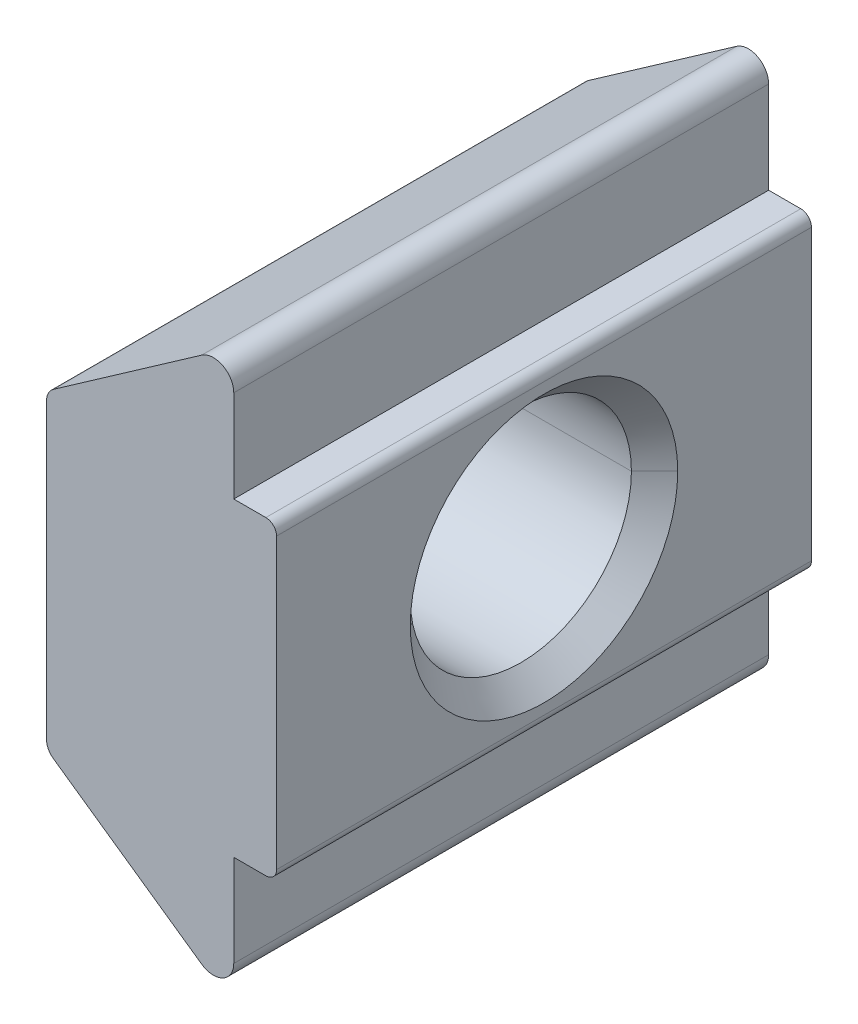
ISO-10303-21;
HEADER;
FILE_DESCRIPTION(('STEP AP214'),'2;1');
FILE_NAME('part.step','',(''),(''),'','','');
FILE_SCHEMA(('AUTOMOTIVE_DESIGN { 1 0 10303 214 1 1 1 1 }'));
ENDSEC;
DATA;
#1=APPLICATION_CONTEXT('core data for automotive mechanical design processes');
#2=APPLICATION_PROTOCOL_DEFINITION('international standard','automotive_design',2000,#1);
#3=PRODUCT_CONTEXT('',#1,'mechanical');
#4=PRODUCT('Part','Part','',(#3));
#5=PRODUCT_RELATED_PRODUCT_CATEGORY('part','',(#4));
#6=PRODUCT_DEFINITION_FORMATION('','',#4);
#7=PRODUCT_DEFINITION_CONTEXT('part definition',#1,'design');
#8=PRODUCT_DEFINITION('design','',#6,#7);
#9=PRODUCT_DEFINITION_SHAPE('','',#8);
#10=(LENGTH_UNIT() NAMED_UNIT(*) SI_UNIT(.MILLI.,.METRE.));
#11=(NAMED_UNIT(*) PLANE_ANGLE_UNIT() SI_UNIT($,.RADIAN.));
#12=(NAMED_UNIT(*) SI_UNIT($,.STERADIAN.) SOLID_ANGLE_UNIT());
#13=UNCERTAINTY_MEASURE_WITH_UNIT(LENGTH_MEASURE(1.E-05),#10,'distance_accuracy_value','');
#14=(GEOMETRIC_REPRESENTATION_CONTEXT(3) GLOBAL_UNCERTAINTY_ASSIGNED_CONTEXT((#13)) GLOBAL_UNIT_ASSIGNED_CONTEXT((#10,
#11,#12)) REPRESENTATION_CONTEXT('',''));
#15=CARTESIAN_POINT('',(0.,0.,0.));
#16=DIRECTION('',(0.,0.,1.));
#17=DIRECTION('',(1.,0.,0.));
#18=AXIS2_PLACEMENT_3D('',#15,#16,#17);
#19=CARTESIAN_POINT('',(-4.00000000000035,2.74380333152817,5.));
#20=DIRECTION('',(0.,0.,-1.));
#21=DIRECTION('',(0.886978676283514,-0.461810380804011,0.));
#22=AXIS2_PLACEMENT_3D('',#19,#20,#21);
#23=CYLINDRICAL_SURFACE('',#22,0.299999999999656);
#24=CARTESIAN_POINT('',(-4.00000000000035,2.74380333152817,-5.));
#25=DIRECTION('',(0.,0.,1.));
#26=DIRECTION('',(1.,0.,0.));
#27=AXIS2_PLACEMENT_3D('',#24,#25,#26);
#28=CIRCLE('',#27,0.299999999999656);
#29=CARTESIAN_POINT('',(-4.172038703309,2.9895729076837,-5.));
#30=VERTEX_POINT('',#29);
#31=CARTESIAN_POINT('',(-4.3,2.743803331528,-5.));
#32=VERTEX_POINT('',#31);
#33=EDGE_CURVE('E11',#30,#32,#28,.T.);
#34=ORIENTED_EDGE('',*,*,#33,.T.);
#35=DIRECTION('',(0.,0.,-1.));
#36=VECTOR('',#35,1.);
#37=CARTESIAN_POINT('',(-4.3,2.743803331528,5.));
#38=LINE('',#37,#36);
#39=CARTESIAN_POINT('',(-4.3,2.743803331528,5.));
#40=VERTEX_POINT('',#39);
#41=EDGE_CURVE('E25',#40,#32,#38,.T.);
#42=ORIENTED_EDGE('',*,*,#41,.F.);
#43=CARTESIAN_POINT('',(-4.00000000000035,2.74380333152817,5.));
#44=DIRECTION('',(0.,0.,1.));
#45=DIRECTION('',(1.,0.,0.));
#46=AXIS2_PLACEMENT_3D('',#43,#44,#45);
#47=CIRCLE('',#46,0.299999999999656);
#48=CARTESIAN_POINT('',(-4.172038703309,2.9895729076837,5.));
#49=VERTEX_POINT('',#48);
#50=EDGE_CURVE('E391',#49,#40,#47,.T.);
#51=ORIENTED_EDGE('',*,*,#50,.F.);
#52=DIRECTION('',(0.,0.,-1.));
#53=VECTOR('',#52,1.);
#54=CARTESIAN_POINT('',(-4.172038703309,2.9895729076837,5.));
#55=LINE('',#54,#53);
#56=EDGE_CURVE('E387',#49,#30,#55,.T.);
#57=ORIENTED_EDGE('',*,*,#56,.T.);
#58=EDGE_LOOP('',(#34,#42,#51,#57));
#59=FACE_BOUND('',#58,.T.);
#60=ADVANCED_FACE('F17',(#59),#23,.T.);
#61=CARTESIAN_POINT('',(-1.3982147651007,4.9312496644295,5.));
#62=DIRECTION('',(0.573462344363326,-0.819231920519042,0.));
#63=DIRECTION('',(0.819231920519042,0.573462344363326,0.));
#64=AXIS2_PLACEMENT_3D('',#61,#62,#63);
#65=PLANE('',#64);
#66=DIRECTION('',(-0.819231920519042,-0.573462344363326,0.));
#67=VECTOR('',#66,1.);
#68=CARTESIAN_POINT('',(-1.3982147651007,4.9312496644295,-5.));
#69=LINE('',#68,#67);
#70=CARTESIAN_POINT('',(-1.3982147651007,4.9312496644295,-5.));
#71=VERTEX_POINT('',#70);
#72=EDGE_CURVE('E382',#71,#30,#69,.T.);
#73=ORIENTED_EDGE('',*,*,#72,.T.);
#74=ORIENTED_EDGE('',*,*,#56,.F.);
#75=DIRECTION('',(-0.819231920519042,-0.573462344363326,0.));
#76=VECTOR('',#75,1.);
#77=CARTESIAN_POINT('',(-1.3982147651007,4.9312496644295,5.));
#78=LINE('',#77,#76);
#79=CARTESIAN_POINT('',(-1.3982147651007,4.9312496644295,5.));
#80=VERTEX_POINT('',#79);
#81=EDGE_CURVE('E377',#80,#49,#78,.T.);
#82=ORIENTED_EDGE('',*,*,#81,.F.);
#83=DIRECTION('',(0.,0.,-1.));
#84=VECTOR('',#83,1.);
#85=CARTESIAN_POINT('',(-1.3982147651007,4.9312496644295,5.));
#86=LINE('',#85,#84);
#87=EDGE_CURVE('E373',#80,#71,#86,.T.);
#88=ORIENTED_EDGE('',*,*,#87,.T.);
#89=EDGE_LOOP('',(#73,#74,#82,#88));
#90=FACE_BOUND('',#89,.T.);
#91=ADVANCED_FACE('F409',(#90),#65,.F.);
#92=CARTESIAN_POINT('',(-1.1801999985467,4.61976675709041,5.));
#93=DIRECTION('',(0.,0.,-1.));
#94=DIRECTION('',(-0.461793833623986,-0.886987291468633,0.));
#95=AXIS2_PLACEMENT_3D('',#92,#93,#94);
#96=CYLINDRICAL_SURFACE('',#95,0.380200000000007);
#97=CARTESIAN_POINT('',(-1.1801999985467,4.61976675709041,-5.));
#98=DIRECTION('',(0.,0.,1.));
#99=DIRECTION('',(1.,0.,0.));
#100=AXIS2_PLACEMENT_3D('',#97,#98,#99);
#101=CIRCLE('',#100,0.380200000000007);
#102=CARTESIAN_POINT('',(-0.8,4.6198,-5.));
#103=VERTEX_POINT('',#102);
#104=EDGE_CURVE('E368',#103,#71,#101,.T.);
#105=ORIENTED_EDGE('',*,*,#104,.T.);
#106=ORIENTED_EDGE('',*,*,#87,.F.);
#107=CARTESIAN_POINT('',(-1.1801999985467,4.61976675709041,5.));
#108=DIRECTION('',(0.,0.,1.));
#109=DIRECTION('',(1.,0.,0.));
#110=AXIS2_PLACEMENT_3D('',#107,#108,#109);
#111=CIRCLE('',#110,0.380200000000007);
#112=CARTESIAN_POINT('',(-0.8,4.6198,5.));
#113=VERTEX_POINT('',#112);
#114=EDGE_CURVE('E363',#113,#80,#111,.T.);
#115=ORIENTED_EDGE('',*,*,#114,.F.);
#116=DIRECTION('',(0.,0.,-1.));
#117=VECTOR('',#116,1.);
#118=CARTESIAN_POINT('',(-0.8,4.6198,5.));
#119=LINE('',#118,#117);
#120=EDGE_CURVE('E359',#113,#103,#119,.T.);
#121=ORIENTED_EDGE('',*,*,#120,.T.);
#122=EDGE_LOOP('',(#105,#106,#115,#121));
#123=FACE_BOUND('',#122,.T.);
#124=ADVANCED_FACE('F454',(#123),#96,.T.);
#125=CARTESIAN_POINT('',(-0.8,2.9,5.));
#126=DIRECTION('',(-1.,0.,0.));
#127=DIRECTION('',(0.,0.,1.));
#128=AXIS2_PLACEMENT_3D('',#125,#126,#127);
#129=PLANE('',#128);
#130=DIRECTION('',(0.,1.,0.));
#131=VECTOR('',#130,1.);
#132=CARTESIAN_POINT('',(-0.8,2.9,-5.));
#133=LINE('',#132,#131);
#134=CARTESIAN_POINT('',(-0.8,2.9,-5.));
#135=VERTEX_POINT('',#134);
#136=EDGE_CURVE('E354',#135,#103,#133,.T.);
#137=ORIENTED_EDGE('',*,*,#136,.T.);
#138=ORIENTED_EDGE('',*,*,#120,.F.);
#139=DIRECTION('',(0.,1.,0.));
#140=VECTOR('',#139,1.);
#141=CARTESIAN_POINT('',(-0.8,2.9,5.));
#142=LINE('',#141,#140);
#143=CARTESIAN_POINT('',(-0.8,2.9,5.));
#144=VERTEX_POINT('',#143);
#145=EDGE_CURVE('E349',#144,#113,#142,.T.);
#146=ORIENTED_EDGE('',*,*,#145,.F.);
#147=DIRECTION('',(0.,0.,-1.));
#148=VECTOR('',#147,1.);
#149=CARTESIAN_POINT('',(-0.8,2.9,5.));
#150=LINE('',#149,#148);
#151=EDGE_CURVE('E345',#144,#135,#150,.T.);
#152=ORIENTED_EDGE('',*,*,#151,.T.);
#153=EDGE_LOOP('',(#137,#138,#146,#152));
#154=FACE_BOUND('',#153,.T.);
#155=ADVANCED_FACE('F451',(#154),#129,.F.);
#156=CARTESIAN_POINT('',(-0.2,2.9,5.));
#157=DIRECTION('',(0.,-1.,0.));
#158=DIRECTION('',(0.,0.,-1.));
#159=AXIS2_PLACEMENT_3D('',#156,#157,#158);
#160=PLANE('',#159);
#161=DIRECTION('',(-1.,0.,0.));
#162=VECTOR('',#161,1.);
#163=CARTESIAN_POINT('',(-0.2,2.9,-5.));
#164=LINE('',#163,#162);
#165=CARTESIAN_POINT('',(-0.2,2.9,-5.));
#166=VERTEX_POINT('',#165);
#167=EDGE_CURVE('E340',#166,#135,#164,.T.);
#168=ORIENTED_EDGE('',*,*,#167,.T.);
#169=ORIENTED_EDGE('',*,*,#151,.F.);
#170=DIRECTION('',(-1.,0.,0.));
#171=VECTOR('',#170,1.);
#172=CARTESIAN_POINT('',(-0.2,2.9,5.));
#173=LINE('',#172,#171);
#174=CARTESIAN_POINT('',(-0.2,2.9,5.));
#175=VERTEX_POINT('',#174);
#176=EDGE_CURVE('E335',#175,#144,#173,.T.);
#177=ORIENTED_EDGE('',*,*,#176,.F.);
#178=DIRECTION('',(0.,0.,-1.));
#179=VECTOR('',#178,1.);
#180=CARTESIAN_POINT('',(-0.2,2.9,5.));
#181=LINE('',#180,#179);
#182=EDGE_CURVE('E331',#175,#166,#181,.T.);
#183=ORIENTED_EDGE('',*,*,#182,.T.);
#184=EDGE_LOOP('',(#168,#169,#177,#183));
#185=FACE_BOUND('',#184,.T.);
#186=ADVANCED_FACE('F447',(#185),#160,.F.);
#187=CARTESIAN_POINT('',(-0.200000000000018,2.7,5.));
#188=DIRECTION('',(0.,0.,-1.));
#189=DIRECTION('',(-0.707106781186579,-0.707106781186516,0.));
#190=AXIS2_PLACEMENT_3D('',#187,#188,#189);
#191=CYLINDRICAL_SURFACE('',#190,0.200000000000018);
#192=CARTESIAN_POINT('',(-0.200000000000018,2.7,-5.));
#193=DIRECTION('',(0.,0.,1.));
#194=DIRECTION('',(1.,0.,0.));
#195=AXIS2_PLACEMENT_3D('',#192,#193,#194);
#196=CIRCLE('',#195,0.200000000000018);
#197=CARTESIAN_POINT('',(0.,2.7,-5.));
#198=VERTEX_POINT('',#197);
#199=EDGE_CURVE('E326',#198,#166,#196,.T.);
#200=ORIENTED_EDGE('',*,*,#199,.T.);
#201=ORIENTED_EDGE('',*,*,#182,.F.);
#202=CARTESIAN_POINT('',(-0.200000000000018,2.7,5.));
#203=DIRECTION('',(0.,0.,1.));
#204=DIRECTION('',(1.,0.,0.));
#205=AXIS2_PLACEMENT_3D('',#202,#203,#204);
#206=CIRCLE('',#205,0.200000000000018);
#207=CARTESIAN_POINT('',(0.,2.7,5.));
#208=VERTEX_POINT('',#207);
#209=EDGE_CURVE('E321',#208,#175,#206,.T.);
#210=ORIENTED_EDGE('',*,*,#209,.F.);
#211=DIRECTION('',(0.,0.,-1.));
#212=VECTOR('',#211,1.);
#213=CARTESIAN_POINT('',(0.,2.7,5.));
#214=LINE('',#213,#212);
#215=EDGE_CURVE('E317',#208,#198,#214,.T.);
#216=ORIENTED_EDGE('',*,*,#215,.T.);
#217=EDGE_LOOP('',(#200,#201,#210,#216));
#218=FACE_BOUND('',#217,.T.);
#219=ADVANCED_FACE('F444',(#218),#191,.T.);
#220=CARTESIAN_POINT('',(0.,-2.7,5.));
#221=DIRECTION('',(-1.,0.,0.));
#222=DIRECTION('',(0.,0.,1.));
#223=AXIS2_PLACEMENT_3D('',#220,#221,#222);
#224=PLANE('',#223);
#225=CARTESIAN_POINT('',(0.,0.,0.));
#226=DIRECTION('',(1.,0.,0.));
#227=DIRECTION('',(0.,0.,-1.));
#228=AXIS2_PLACEMENT_3D('',#225,#226,#227);
#229=CIRCLE('',#228,2.5);
#230=CARTESIAN_POINT('',(0.,0.,2.5));
#231=VERTEX_POINT('',#230);
#232=CARTESIAN_POINT('',(0.,0.,-2.5));
#233=VERTEX_POINT('',#232);
#234=EDGE_CURVE('E156',#231,#233,#229,.T.);
#235=ORIENTED_EDGE('',*,*,#234,.F.);
#236=CARTESIAN_POINT('',(0.,0.,0.));
#237=DIRECTION('',(1.,0.,0.));
#238=DIRECTION('',(0.,0.,-1.));
#239=AXIS2_PLACEMENT_3D('',#236,#237,#238);
#240=CIRCLE('',#239,2.5);
#241=EDGE_CURVE('E310',#233,#231,#240,.T.);
#242=ORIENTED_EDGE('',*,*,#241,.F.);
#243=EDGE_LOOP('',(#235,#242));
#244=FACE_BOUND('',#243,.T.);
#245=DIRECTION('',(0.,1.,0.));
#246=VECTOR('',#245,1.);
#247=CARTESIAN_POINT('',(0.,-2.7,-5.));
#248=LINE('',#247,#246);
#249=CARTESIAN_POINT('',(0.,-2.7,-5.));
#250=VERTEX_POINT('',#249);
#251=EDGE_CURVE('E305',#250,#198,#248,.T.);
#252=ORIENTED_EDGE('',*,*,#251,.T.);
#253=ORIENTED_EDGE('',*,*,#215,.F.);
#254=DIRECTION('',(0.,1.,0.));
#255=VECTOR('',#254,1.);
#256=CARTESIAN_POINT('',(0.,-2.7,5.));
#257=LINE('',#256,#255);
#258=CARTESIAN_POINT('',(0.,-2.7,5.));
#259=VERTEX_POINT('',#258);
#260=EDGE_CURVE('E300',#259,#208,#257,.T.);
#261=ORIENTED_EDGE('',*,*,#260,.F.);
#262=DIRECTION('',(0.,0.,-1.));
#263=VECTOR('',#262,1.);
#264=CARTESIAN_POINT('',(0.,-2.7,5.));
#265=LINE('',#264,#263);
#266=EDGE_CURVE('E296',#259,#250,#265,.T.);
#267=ORIENTED_EDGE('',*,*,#266,.T.);
#268=EDGE_LOOP('',(#252,#253,#261,#267));
#269=FACE_BOUND('',#268,.T.);
#270=ADVANCED_FACE('F439',(#244,#269),#224,.F.);
#271=CARTESIAN_POINT('',(-0.200000000000018,-2.7,5.));
#272=DIRECTION('',(0.,0.,-1.));
#273=DIRECTION('',(-0.707106781186562,0.707106781186533,0.));
#274=AXIS2_PLACEMENT_3D('',#271,#272,#273);
#275=CYLINDRICAL_SURFACE('',#274,0.200000000000018);
#276=CARTESIAN_POINT('',(-0.200000000000018,-2.7,-5.));
#277=DIRECTION('',(0.,0.,1.));
#278=DIRECTION('',(1.,0.,0.));
#279=AXIS2_PLACEMENT_3D('',#276,#277,#278);
#280=CIRCLE('',#279,0.200000000000018);
#281=CARTESIAN_POINT('',(-0.20000000000001,-2.9,-5.));
#282=VERTEX_POINT('',#281);
#283=EDGE_CURVE('E291',#282,#250,#280,.T.);
#284=ORIENTED_EDGE('',*,*,#283,.T.);
#285=ORIENTED_EDGE('',*,*,#266,.F.);
#286=CARTESIAN_POINT('',(-0.200000000000018,-2.7,5.));
#287=DIRECTION('',(0.,0.,1.));
#288=DIRECTION('',(1.,0.,0.));
#289=AXIS2_PLACEMENT_3D('',#286,#287,#288);
#290=CIRCLE('',#289,0.200000000000018);
#291=CARTESIAN_POINT('',(-0.20000000000001,-2.9,5.));
#292=VERTEX_POINT('',#291);
#293=EDGE_CURVE('E286',#292,#259,#290,.T.);
#294=ORIENTED_EDGE('',*,*,#293,.F.);
#295=DIRECTION('',(0.,0.,-1.));
#296=VECTOR('',#295,1.);
#297=CARTESIAN_POINT('',(-0.20000000000001,-2.9,5.));
#298=LINE('',#297,#296);
#299=EDGE_CURVE('E282',#292,#282,#298,.T.);
#300=ORIENTED_EDGE('',*,*,#299,.T.);
#301=EDGE_LOOP('',(#284,#285,#294,#300));
#302=FACE_BOUND('',#301,.T.);
#303=ADVANCED_FACE('F436',(#302),#275,.T.);
#304=CARTESIAN_POINT('',(-0.79999999999999,-2.9,5.));
#305=DIRECTION('',(0.,1.,0.));
#306=DIRECTION('',(0.,0.,1.));
#307=AXIS2_PLACEMENT_3D('',#304,#305,#306);
#308=PLANE('',#307);
#309=DIRECTION('',(1.,0.,0.));
#310=VECTOR('',#309,1.);
#311=CARTESIAN_POINT('',(-0.79999999999999,-2.9,-5.));
#312=LINE('',#311,#310);
#313=CARTESIAN_POINT('',(-0.79999999999999,-2.9,-5.));
#314=VERTEX_POINT('',#313);
#315=EDGE_CURVE('E277',#314,#282,#312,.T.);
#316=ORIENTED_EDGE('',*,*,#315,.T.);
#317=ORIENTED_EDGE('',*,*,#299,.F.);
#318=DIRECTION('',(1.,0.,0.));
#319=VECTOR('',#318,1.);
#320=CARTESIAN_POINT('',(-0.79999999999999,-2.9,5.));
#321=LINE('',#320,#319);
#322=CARTESIAN_POINT('',(-0.79999999999999,-2.9,5.));
#323=VERTEX_POINT('',#322);
#324=EDGE_CURVE('E272',#323,#292,#321,.T.);
#325=ORIENTED_EDGE('',*,*,#324,.F.);
#326=DIRECTION('',(0.,0.,-1.));
#327=VECTOR('',#326,1.);
#328=CARTESIAN_POINT('',(-0.79999999999999,-2.9,5.));
#329=LINE('',#328,#327);
#330=EDGE_CURVE('E268',#323,#314,#329,.T.);
#331=ORIENTED_EDGE('',*,*,#330,.T.);
#332=EDGE_LOOP('',(#316,#317,#325,#331));
#333=FACE_BOUND('',#332,.T.);
#334=ADVANCED_FACE('F433',(#333),#308,.F.);
#335=CARTESIAN_POINT('',(-0.79999999999999,-4.6198,5.));
#336=DIRECTION('',(-1.,0.,0.));
#337=DIRECTION('',(0.,0.,1.));
#338=AXIS2_PLACEMENT_3D('',#335,#336,#337);
#339=PLANE('',#338);
#340=DIRECTION('',(0.,1.,0.));
#341=VECTOR('',#340,1.);
#342=CARTESIAN_POINT('',(-0.79999999999999,-4.6198,-5.));
#343=LINE('',#342,#341);
#344=CARTESIAN_POINT('',(-0.79999999999999,-4.6198,-5.));
#345=VERTEX_POINT('',#344);
#346=EDGE_CURVE('E263',#345,#314,#343,.T.);
#347=ORIENTED_EDGE('',*,*,#346,.T.);
#348=ORIENTED_EDGE('',*,*,#330,.F.);
#349=DIRECTION('',(0.,1.,0.));
#350=VECTOR('',#349,1.);
#351=CARTESIAN_POINT('',(-0.79999999999999,-4.6198,5.));
#352=LINE('',#351,#350);
#353=CARTESIAN_POINT('',(-0.79999999999999,-4.6198,5.));
#354=VERTEX_POINT('',#353);
#355=EDGE_CURVE('E258',#354,#323,#352,.T.);
#356=ORIENTED_EDGE('',*,*,#355,.F.);
#357=DIRECTION('',(0.,0.,-1.));
#358=VECTOR('',#357,1.);
#359=CARTESIAN_POINT('',(-0.79999999999999,-4.6198,5.));
#360=LINE('',#359,#358);
#361=EDGE_CURVE('E254',#354,#345,#360,.T.);
#362=ORIENTED_EDGE('',*,*,#361,.T.);
#363=EDGE_LOOP('',(#347,#348,#356,#362));
#364=FACE_BOUND('',#363,.T.);
#365=ADVANCED_FACE('F427',(#364),#339,.F.);
#366=CARTESIAN_POINT('',(-1.1801999985467,-4.6197667570904,5.));
#367=DIRECTION('',(0.,0.,-1.));
#368=DIRECTION('',(-0.46179383362398,0.886987291468636,0.));
#369=AXIS2_PLACEMENT_3D('',#366,#367,#368);
#370=CYLINDRICAL_SURFACE('',#369,0.380200000000017);
#371=CARTESIAN_POINT('',(-1.1801999985467,-4.6197667570904,-5.));
#372=DIRECTION('',(0.,0.,1.));
#373=DIRECTION('',(1.,0.,0.));
#374=AXIS2_PLACEMENT_3D('',#371,#372,#373);
#375=CIRCLE('',#374,0.380200000000017);
#376=CARTESIAN_POINT('',(-1.3982147651007,-4.9312496644295,-5.));
#377=VERTEX_POINT('',#376);
#378=EDGE_CURVE('E249',#377,#345,#375,.T.);
#379=ORIENTED_EDGE('',*,*,#378,.T.);
#380=ORIENTED_EDGE('',*,*,#361,.F.);
#381=CARTESIAN_POINT('',(-1.1801999985467,-4.6197667570904,5.));
#382=DIRECTION('',(0.,0.,1.));
#383=DIRECTION('',(1.,0.,0.));
#384=AXIS2_PLACEMENT_3D('',#381,#382,#383);
#385=CIRCLE('',#384,0.380200000000017);
#386=CARTESIAN_POINT('',(-1.3982147651007,-4.9312496644295,5.));
#387=VERTEX_POINT('',#386);
#388=EDGE_CURVE('E244',#387,#354,#385,.T.);
#389=ORIENTED_EDGE('',*,*,#388,.F.);
#390=DIRECTION('',(0.,0.,-1.));
#391=VECTOR('',#390,1.);
#392=CARTESIAN_POINT('',(-1.3982147651007,-4.9312496644295,5.));
#393=LINE('',#392,#391);
#394=EDGE_CURVE('E240',#387,#377,#393,.T.);
#395=ORIENTED_EDGE('',*,*,#394,.T.);
#396=EDGE_LOOP('',(#379,#380,#389,#395));
#397=FACE_BOUND('',#396,.T.);
#398=ADVANCED_FACE('F424',(#397),#370,.T.);
#399=CARTESIAN_POINT('',(-4.172038703309,-2.9895729076837,5.));
#400=DIRECTION('',(0.573462344363326,0.819231920519042,0.));
#401=DIRECTION('',(-0.819231920519042,0.573462344363326,0.));
#402=AXIS2_PLACEMENT_3D('',#399,#400,#401);
#403=PLANE('',#402);
#404=DIRECTION('',(0.819231920519042,-0.573462344363326,0.));
#405=VECTOR('',#404,1.);
#406=CARTESIAN_POINT('',(-4.172038703309,-2.9895729076837,-5.));
#407=LINE('',#406,#405);
#408=CARTESIAN_POINT('',(-4.172038703309,-2.9895729076837,-5.));
#409=VERTEX_POINT('',#408);
#410=EDGE_CURVE('E235',#409,#377,#407,.T.);
#411=ORIENTED_EDGE('',*,*,#410,.T.);
#412=ORIENTED_EDGE('',*,*,#394,.F.);
#413=DIRECTION('',(0.819231920519042,-0.573462344363326,0.));
#414=VECTOR('',#413,1.);
#415=CARTESIAN_POINT('',(-4.172038703309,-2.9895729076837,5.));
#416=LINE('',#415,#414);
#417=CARTESIAN_POINT('',(-4.172038703309,-2.9895729076837,5.));
#418=VERTEX_POINT('',#417);
#419=EDGE_CURVE('E230',#418,#387,#416,.T.);
#420=ORIENTED_EDGE('',*,*,#419,.F.);
#421=DIRECTION('',(0.,0.,-1.));
#422=VECTOR('',#421,1.);
#423=CARTESIAN_POINT('',(-4.172038703309,-2.9895729076837,5.));
#424=LINE('',#423,#422);
#425=EDGE_CURVE('E226',#418,#409,#424,.T.);
#426=ORIENTED_EDGE('',*,*,#425,.T.);
#427=EDGE_LOOP('',(#411,#412,#420,#426));
#428=FACE_BOUND('',#427,.T.);
#429=ADVANCED_FACE('F422',(#428),#403,.F.);
#430=CARTESIAN_POINT('',(-4.00000000000035,-2.74380333152817,5.));
#431=DIRECTION('',(0.,0.,-1.));
#432=DIRECTION('',(0.886978676283514,0.461810380804011,0.));
#433=AXIS2_PLACEMENT_3D('',#430,#431,#432);
#434=CYLINDRICAL_SURFACE('',#433,0.299999999999656);
#435=CARTESIAN_POINT('',(-4.00000000000035,-2.74380333152817,-5.));
#436=DIRECTION('',(0.,0.,1.));
#437=DIRECTION('',(1.,0.,0.));
#438=AXIS2_PLACEMENT_3D('',#435,#436,#437);
#439=CIRCLE('',#438,0.299999999999656);
#440=CARTESIAN_POINT('',(-4.3,-2.743803331528,-5.));
#441=VERTEX_POINT('',#440);
#442=EDGE_CURVE('E221',#441,#409,#439,.T.);
#443=ORIENTED_EDGE('',*,*,#442,.T.);
#444=ORIENTED_EDGE('',*,*,#425,.F.);
#445=CARTESIAN_POINT('',(-4.00000000000035,-2.74380333152817,5.));
#446=DIRECTION('',(0.,0.,1.));
#447=DIRECTION('',(1.,0.,0.));
#448=AXIS2_PLACEMENT_3D('',#445,#446,#447);
#449=CIRCLE('',#448,0.299999999999656);
#450=CARTESIAN_POINT('',(-4.3,-2.743803331528,5.));
#451=VERTEX_POINT('',#450);
#452=EDGE_CURVE('E216',#451,#418,#449,.T.);
#453=ORIENTED_EDGE('',*,*,#452,.F.);
#454=DIRECTION('',(0.,0.,-1.));
#455=VECTOR('',#454,1.);
#456=CARTESIAN_POINT('',(-4.3,-2.743803331528,5.));
#457=LINE('',#456,#455);
#458=EDGE_CURVE('E212',#451,#441,#457,.T.);
#459=ORIENTED_EDGE('',*,*,#458,.T.);
#460=EDGE_LOOP('',(#443,#444,#453,#459));
#461=FACE_BOUND('',#460,.T.);
#462=ADVANCED_FACE('F418',(#461),#434,.T.);
#463=CARTESIAN_POINT('',(-4.3,2.743803331528,5.));
#464=DIRECTION('',(1.,0.,0.));
#465=DIRECTION('',(0.,0.,-1.));
#466=AXIS2_PLACEMENT_3D('',#463,#464,#465);
#467=PLANE('',#466);
#468=CARTESIAN_POINT('',(-4.3,0.,0.));
#469=DIRECTION('',(1.,0.,0.));
#470=DIRECTION('',(0.,0.,-1.));
#471=AXIS2_PLACEMENT_3D('',#468,#469,#470);
#472=CIRCLE('',#471,2.5);
#473=CARTESIAN_POINT('',(-4.3,0.,-2.5));
#474=VERTEX_POINT('',#473);
#475=CARTESIAN_POINT('',(-4.3,0.,2.5));
#476=VERTEX_POINT('',#475);
#477=EDGE_CURVE('E208',#474,#476,#472,.T.);
#478=ORIENTED_EDGE('',*,*,#477,.T.);
#479=CARTESIAN_POINT('',(-4.3,0.,0.));
#480=DIRECTION('',(1.,0.,0.));
#481=DIRECTION('',(0.,0.,-1.));
#482=AXIS2_PLACEMENT_3D('',#479,#480,#481);
#483=CIRCLE('',#482,2.5);
#484=EDGE_CURVE('E204',#476,#474,#483,.T.);
#485=ORIENTED_EDGE('',*,*,#484,.T.);
#486=EDGE_LOOP('',(#478,#485));
#487=FACE_BOUND('',#486,.T.);
#488=DIRECTION('',(0.,-1.,0.));
#489=VECTOR('',#488,1.);
#490=CARTESIAN_POINT('',(-4.3,2.743803331528,-5.));
#491=LINE('',#490,#489);
#492=EDGE_CURVE('E199',#32,#441,#491,.T.);
#493=ORIENTED_EDGE('',*,*,#492,.T.);
#494=ORIENTED_EDGE('',*,*,#458,.F.);
#495=DIRECTION('',(0.,-1.,0.));
#496=VECTOR('',#495,1.);
#497=CARTESIAN_POINT('',(-4.3,2.743803331528,5.));
#498=LINE('',#497,#496);
#499=EDGE_CURVE('E194',#40,#451,#498,.T.);
#500=ORIENTED_EDGE('',*,*,#499,.F.);
#501=ORIENTED_EDGE('',*,*,#41,.T.);
#502=EDGE_LOOP('',(#493,#494,#500,#501));
#503=FACE_BOUND('',#502,.T.);
#504=ADVANCED_FACE('F401',(#487,#503),#467,.F.);
#505=CARTESIAN_POINT('',(-4.00000000000035,2.74380333152817,5.));
#506=DIRECTION('',(0.,0.,1.));
#507=DIRECTION('',(1.,0.,0.));
#508=AXIS2_PLACEMENT_3D('',#505,#506,#507);
#509=PLANE('',#508);
#510=ORIENTED_EDGE('',*,*,#50,.T.);
#511=ORIENTED_EDGE('',*,*,#499,.T.);
#512=ORIENTED_EDGE('',*,*,#452,.T.);
#513=ORIENTED_EDGE('',*,*,#419,.T.);
#514=ORIENTED_EDGE('',*,*,#388,.T.);
#515=ORIENTED_EDGE('',*,*,#355,.T.);
#516=ORIENTED_EDGE('',*,*,#324,.T.);
#517=ORIENTED_EDGE('',*,*,#293,.T.);
#518=ORIENTED_EDGE('',*,*,#260,.T.);
#519=ORIENTED_EDGE('',*,*,#209,.T.);
#520=ORIENTED_EDGE('',*,*,#176,.T.);
#521=ORIENTED_EDGE('',*,*,#145,.T.);
#522=ORIENTED_EDGE('',*,*,#114,.T.);
#523=ORIENTED_EDGE('',*,*,#81,.T.);
#524=EDGE_LOOP('',(#510,#511,#512,#513,#514,#515,#516,#517,#518,#519,#520,#521,#522,#523));
#525=FACE_BOUND('',#524,.T.);
#526=ADVANCED_FACE('F405',(#525),#509,.T.);
#527=CARTESIAN_POINT('',(-4.00000000000035,2.74380333152817,-5.));
#528=DIRECTION('',(0.,0.,1.));
#529=DIRECTION('',(1.,0.,0.));
#530=AXIS2_PLACEMENT_3D('',#527,#528,#529);
#531=PLANE('',#530);
#532=ORIENTED_EDGE('',*,*,#33,.F.);
#533=ORIENTED_EDGE('',*,*,#72,.F.);
#534=ORIENTED_EDGE('',*,*,#104,.F.);
#535=ORIENTED_EDGE('',*,*,#136,.F.);
#536=ORIENTED_EDGE('',*,*,#167,.F.);
#537=ORIENTED_EDGE('',*,*,#199,.F.);
#538=ORIENTED_EDGE('',*,*,#251,.F.);
#539=ORIENTED_EDGE('',*,*,#283,.F.);
#540=ORIENTED_EDGE('',*,*,#315,.F.);
#541=ORIENTED_EDGE('',*,*,#346,.F.);
#542=ORIENTED_EDGE('',*,*,#378,.F.);
#543=ORIENTED_EDGE('',*,*,#410,.F.);
#544=ORIENTED_EDGE('',*,*,#442,.F.);
#545=ORIENTED_EDGE('',*,*,#492,.F.);
#546=EDGE_LOOP('',(#532,#533,#534,#535,#536,#537,#538,#539,#540,#541,#542,#543,#544,#545));
#547=FACE_BOUND('',#546,.T.);
#548=ADVANCED_FACE('F413',(#547),#531,.F.);
#549=CARTESIAN_POINT('',(-4.3,0.,0.));
#550=DIRECTION('',(-1.,0.,0.));
#551=DIRECTION('',(0.,1.,0.));
#552=AXIS2_PLACEMENT_3D('',#549,#550,#551);
#553=CONICAL_SURFACE('',#552,2.5,0.785398163397448);
#554=DIRECTION('',(-0.707106781186547,0.,-0.707106781186548));
#555=VECTOR('',#554,1.);
#556=CARTESIAN_POINT('',(-3.867,0.,-2.067));
#557=LINE('',#556,#555);
#558=CARTESIAN_POINT('',(-3.867,0.,-2.067));
#559=VERTEX_POINT('',#558);
#560=EDGE_CURVE('E189',#559,#474,#557,.T.);
#561=ORIENTED_EDGE('',*,*,#560,.T.);
#562=ORIENTED_EDGE('',*,*,#484,.F.);
#563=DIRECTION('',(-0.707106781186547,0.,0.707106781186548));
#564=VECTOR('',#563,1.);
#565=CARTESIAN_POINT('',(-3.867,0.,2.067));
#566=LINE('',#565,#564);
#567=CARTESIAN_POINT('',(-3.867,0.,2.067));
#568=VERTEX_POINT('',#567);
#569=EDGE_CURVE('E184',#568,#476,#566,.T.);
#570=ORIENTED_EDGE('',*,*,#569,.F.);
#571=CARTESIAN_POINT('',(-3.867,0.,0.));
#572=DIRECTION('',(1.,0.,0.));
#573=DIRECTION('',(0.,0.,-1.));
#574=AXIS2_PLACEMENT_3D('',#571,#572,#573);
#575=CIRCLE('',#574,2.067);
#576=EDGE_CURVE('E180',#568,#559,#575,.T.);
#577=ORIENTED_EDGE('',*,*,#576,.T.);
#578=EDGE_LOOP('',(#561,#562,#570,#577));
#579=FACE_BOUND('',#578,.T.);
#580=ADVANCED_FACE('F598',(#579),#553,.F.);
#581=CARTESIAN_POINT('',(0.,0.,0.));
#582=DIRECTION('',(1.,0.,0.));
#583=DIRECTION('',(0.,1.,0.));
#584=AXIS2_PLACEMENT_3D('',#581,#582,#583);
#585=CYLINDRICAL_SURFACE('',#584,2.067);
#586=DIRECTION('',(1.,0.,0.));
#587=VECTOR('',#586,1.);
#588=CARTESIAN_POINT('',(-3.867,0.,2.067));
#589=LINE('',#588,#587);
#590=CARTESIAN_POINT('',(-0.433,0.,2.067));
#591=VERTEX_POINT('',#590);
#592=EDGE_CURVE('E146',#568,#591,#589,.T.);
#593=ORIENTED_EDGE('',*,*,#592,.T.);
#594=CARTESIAN_POINT('',(-0.433,0.,0.));
#595=DIRECTION('',(1.,0.,0.));
#596=DIRECTION('',(0.,0.,-1.));
#597=AXIS2_PLACEMENT_3D('',#594,#595,#596);
#598=CIRCLE('',#597,2.067);
#599=CARTESIAN_POINT('',(-0.433,0.,-2.067));
#600=VERTEX_POINT('',#599);
#601=EDGE_CURVE('E138',#591,#600,#598,.T.);
#602=ORIENTED_EDGE('',*,*,#601,.T.);
#603=DIRECTION('',(1.,0.,0.));
#604=VECTOR('',#603,1.);
#605=CARTESIAN_POINT('',(-3.867,0.,-2.067));
#606=LINE('',#605,#604);
#607=EDGE_CURVE('E143',#559,#600,#606,.T.);
#608=ORIENTED_EDGE('',*,*,#607,.F.);
#609=ORIENTED_EDGE('',*,*,#576,.F.);
#610=EDGE_LOOP('',(#593,#602,#608,#609));
#611=FACE_BOUND('',#610,.T.);
#612=ADVANCED_FACE('F140',(#611),#585,.F.);
#613=CARTESIAN_POINT('',(0.,0.,0.));
#614=DIRECTION('',(1.,0.,0.));
#615=DIRECTION('',(0.,-1.,0.));
#616=AXIS2_PLACEMENT_3D('',#613,#614,#615);
#617=CYLINDRICAL_SURFACE('',#616,2.067);
#618=ORIENTED_EDGE('',*,*,#592,.F.);
#619=CARTESIAN_POINT('',(-3.867,0.,0.));
#620=DIRECTION('',(1.,0.,0.));
#621=DIRECTION('',(0.,0.,-1.));
#622=AXIS2_PLACEMENT_3D('',#619,#620,#621);
#623=CIRCLE('',#622,2.067);
#624=EDGE_CURVE('E165',#559,#568,#623,.T.);
#625=ORIENTED_EDGE('',*,*,#624,.F.);
#626=ORIENTED_EDGE('',*,*,#607,.T.);
#627=CARTESIAN_POINT('',(-0.433,0.,0.));
#628=DIRECTION('',(1.,0.,0.));
#629=DIRECTION('',(0.,0.,-1.));
#630=AXIS2_PLACEMENT_3D('',#627,#628,#629);
#631=CIRCLE('',#630,2.067);
#632=EDGE_CURVE('E162',#600,#591,#631,.T.);
#633=ORIENTED_EDGE('',*,*,#632,.T.);
#634=EDGE_LOOP('',(#618,#625,#626,#633));
#635=FACE_BOUND('',#634,.T.);
#636=ADVANCED_FACE('F167',(#635),#617,.F.);
#637=CARTESIAN_POINT('',(-0.433,0.,0.));
#638=DIRECTION('',(1.,0.,0.));
#639=DIRECTION('',(0.,-1.,0.));
#640=AXIS2_PLACEMENT_3D('',#637,#638,#639);
#641=CONICAL_SURFACE('',#640,2.067,0.785398163397448);
#642=DIRECTION('',(0.707106781186547,0.,0.707106781186548));
#643=VECTOR('',#642,1.);
#644=CARTESIAN_POINT('',(-0.433,0.,2.067));
#645=LINE('',#644,#643);
#646=EDGE_CURVE('E159',#591,#231,#645,.T.);
#647=ORIENTED_EDGE('',*,*,#646,.F.);
#648=ORIENTED_EDGE('',*,*,#632,.F.);
#649=DIRECTION('',(0.707106781186547,0.,-0.707106781186548));
#650=VECTOR('',#649,1.);
#651=CARTESIAN_POINT('',(-0.433,0.,-2.067));
#652=LINE('',#651,#650);
#653=EDGE_CURVE('E153',#600,#233,#652,.T.);
#654=ORIENTED_EDGE('',*,*,#653,.T.);
#655=ORIENTED_EDGE('',*,*,#241,.T.);
#656=EDGE_LOOP('',(#647,#648,#654,#655));
#657=FACE_BOUND('',#656,.T.);
#658=ADVANCED_FACE('F163',(#657),#641,.F.);
#659=CARTESIAN_POINT('',(-0.433,0.,0.));
#660=DIRECTION('',(1.,0.,0.));
#661=DIRECTION('',(0.,1.,0.));
#662=AXIS2_PLACEMENT_3D('',#659,#660,#661);
#663=CONICAL_SURFACE('',#662,2.067,0.785398163397448);
#664=ORIENTED_EDGE('',*,*,#646,.T.);
#665=ORIENTED_EDGE('',*,*,#234,.T.);
#666=ORIENTED_EDGE('',*,*,#653,.F.);
#667=ORIENTED_EDGE('',*,*,#601,.F.);
#668=EDGE_LOOP('',(#664,#665,#666,#667));
#669=FACE_BOUND('',#668,.T.);
#670=ADVANCED_FACE('F155',(#669),#663,.F.);
#671=CARTESIAN_POINT('',(-4.3,0.,0.));
#672=DIRECTION('',(-1.,0.,0.));
#673=DIRECTION('',(0.,-1.,0.));
#674=AXIS2_PLACEMENT_3D('',#671,#672,#673);
#675=CONICAL_SURFACE('',#674,2.5,0.785398163397448);
#676=ORIENTED_EDGE('',*,*,#560,.F.);
#677=ORIENTED_EDGE('',*,*,#624,.T.);
#678=ORIENTED_EDGE('',*,*,#569,.T.);
#679=ORIENTED_EDGE('',*,*,#477,.F.);
#680=EDGE_LOOP('',(#676,#677,#678,#679));
#681=FACE_BOUND('',#680,.T.);
#682=ADVANCED_FACE('F645',(#681),#675,.F.);
#683=CLOSED_SHELL('',(#60,#91,#124,#155,#186,#219,#270,#303,#334,#365,#398,#429,#462,#504,#526,
#548,#580,#612,#636,#658,#670,#682));
#684=MANIFOLD_SOLID_BREP('B1',#683);
#685=ADVANCED_BREP_SHAPE_REPRESENTATION('',(#18,#684),#14);
#686=SHAPE_DEFINITION_REPRESENTATION(#9,#685);
ENDSEC;
END-ISO-10303-21;
